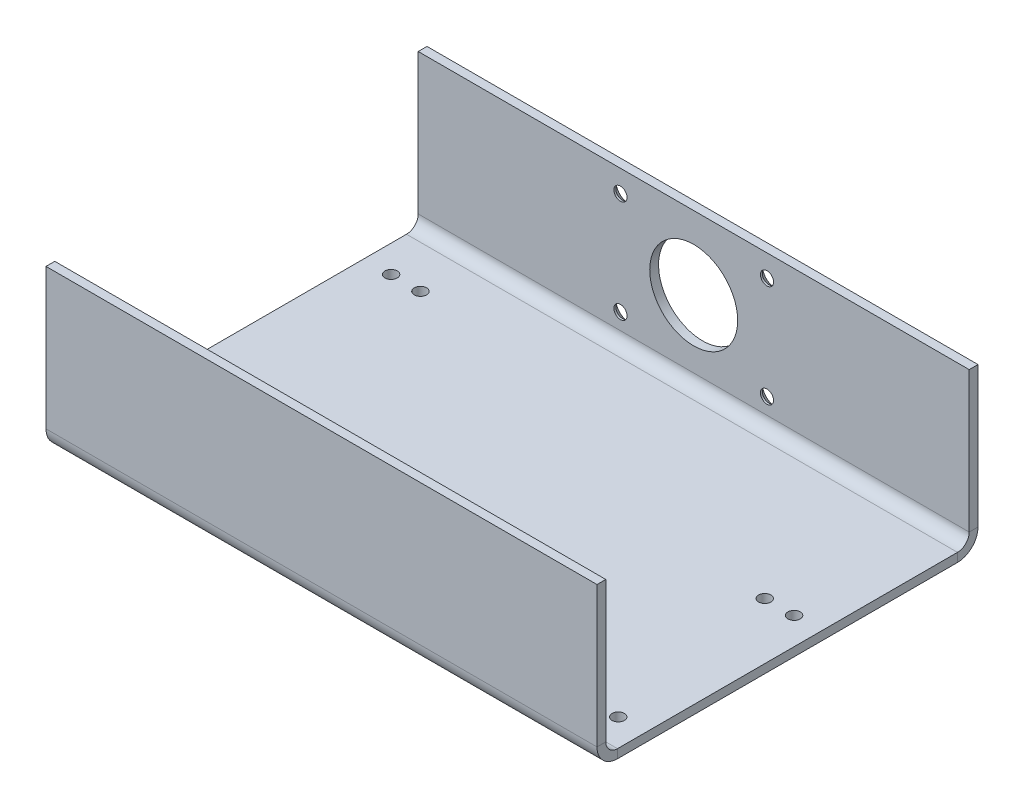
ISO-10303-21;
HEADER;
FILE_DESCRIPTION(('STEP AP214'),'2;1');
FILE_NAME('part.step','',(''),(''),'','','');
FILE_SCHEMA(('AUTOMOTIVE_DESIGN { 1 0 10303 214 1 1 1 1 }'));
ENDSEC;
DATA;
#1=APPLICATION_CONTEXT('core data for automotive mechanical design processes');
#2=APPLICATION_PROTOCOL_DEFINITION('international standard','automotive_design',2000,#1);
#3=PRODUCT_CONTEXT('',#1,'mechanical');
#4=PRODUCT('Part','Part','',(#3));
#5=PRODUCT_RELATED_PRODUCT_CATEGORY('part','',(#4));
#6=PRODUCT_DEFINITION_FORMATION('','',#4);
#7=PRODUCT_DEFINITION_CONTEXT('part definition',#1,'design');
#8=PRODUCT_DEFINITION('design','',#6,#7);
#9=PRODUCT_DEFINITION_SHAPE('','',#8);
#10=(LENGTH_UNIT() NAMED_UNIT(*) SI_UNIT(.MILLI.,.METRE.));
#11=(NAMED_UNIT(*) PLANE_ANGLE_UNIT() SI_UNIT($,.RADIAN.));
#12=(NAMED_UNIT(*) SI_UNIT($,.STERADIAN.) SOLID_ANGLE_UNIT());
#13=UNCERTAINTY_MEASURE_WITH_UNIT(LENGTH_MEASURE(1.E-05),#10,'distance_accuracy_value','');
#14=(GEOMETRIC_REPRESENTATION_CONTEXT(3) GLOBAL_UNCERTAINTY_ASSIGNED_CONTEXT((#13)) GLOBAL_UNIT_ASSIGNED_CONTEXT((#10,
#11,#12)) REPRESENTATION_CONTEXT('',''));
#15=CARTESIAN_POINT('',(0.,0.,0.));
#16=DIRECTION('',(0.,0.,1.));
#17=DIRECTION('',(1.,0.,0.));
#18=AXIS2_PLACEMENT_3D('',#15,#16,#17);
#19=CARTESIAN_POINT('',(0.,-2.35988495893514E-13,-65.));
#20=DIRECTION('',(0.,0.,1.));
#21=DIRECTION('',(0.,-1.,0.));
#22=AXIS2_PLACEMENT_3D('',#19,#20,#21);
#23=PLANE('',#22);
#24=CARTESIAN_POINT('',(24.9999999999492,12.5210335892413,-65.));
#25=DIRECTION('',(0.,0.,-1.));
#26=DIRECTION('',(0.,1.,0.));
#27=AXIS2_PLACEMENT_3D('',#24,#25,#26);
#28=CIRCLE('',#27,4.59);
#29=CARTESIAN_POINT('',(24.9999999999492,17.1110335892413,-65.));
#30=VERTEX_POINT('',#29);
#31=EDGE_CURVE('E311',#30,#30,#28,.T.);
#32=ORIENTED_EDGE('',*,*,#31,.F.);
#33=EDGE_LOOP('',(#32));
#34=FACE_BOUND('',#33,.T.);
#35=CARTESIAN_POINT('',(-25.0000000000508,47.4789664107578,-65.0000000000001));
#36=DIRECTION('',(0.,0.,-1.));
#37=DIRECTION('',(0.,1.,0.));
#38=AXIS2_PLACEMENT_3D('',#35,#36,#37);
#39=CIRCLE('',#38,4.59);
#40=CARTESIAN_POINT('',(-25.0000000000508,52.0689664107578,-65.0000000000002));
#41=VERTEX_POINT('',#40);
#42=EDGE_CURVE('E304',#41,#41,#39,.T.);
#43=ORIENTED_EDGE('',*,*,#42,.F.);
#44=EDGE_LOOP('',(#43));
#45=FACE_BOUND('',#44,.T.);
#46=CARTESIAN_POINT('',(-25.0000000000508,12.5210335892413,-65.));
#47=DIRECTION('',(0.,0.,-1.));
#48=DIRECTION('',(0.,1.,0.));
#49=AXIS2_PLACEMENT_3D('',#46,#47,#48);
#50=CIRCLE('',#49,4.59);
#51=CARTESIAN_POINT('',(-25.0000000000508,17.1110335892413,-65.));
#52=VERTEX_POINT('',#51);
#53=EDGE_CURVE('E300',#52,#52,#50,.T.);
#54=ORIENTED_EDGE('',*,*,#53,.F.);
#55=EDGE_LOOP('',(#54));
#56=FACE_BOUND('',#55,.T.);
#57=CARTESIAN_POINT('',(-5.09869924059103E-11,29.9999999999996,-65.0000000000001));
#58=DIRECTION('',(0.,0.,-1.));
#59=DIRECTION('',(0.,1.,0.));
#60=AXIS2_PLACEMENT_3D('',#57,#58,#59);
#61=CIRCLE('',#60,15.);
#62=CARTESIAN_POINT('',(-5.09869924059103E-11,44.9999999999996,-65.0000000000001));
#63=VERTEX_POINT('',#62);
#64=EDGE_CURVE('E293',#63,#63,#61,.T.);
#65=ORIENTED_EDGE('',*,*,#64,.F.);
#66=EDGE_LOOP('',(#65));
#67=FACE_BOUND('',#66,.T.);
#68=DIRECTION('',(-1.,0.,0.));
#69=VECTOR('',#68,1.);
#70=CARTESIAN_POINT('',(94.,7.00000000000001,-65.));
#71=LINE('',#70,#69);
#72=CARTESIAN_POINT('',(-94.,7.00000000000001,-65.));
#73=VERTEX_POINT('',#72);
#74=CARTESIAN_POINT('',(94.,6.99999999999994,-65.));
#75=VERTEX_POINT('',#74);
#76=EDGE_CURVE('E255',#73,#75,#71,.F.);
#77=ORIENTED_EDGE('',*,*,#76,.F.);
#78=DIRECTION('',(0.,1.,0.));
#79=VECTOR('',#78,1.);
#80=CARTESIAN_POINT('',(-94.,-1.8581495535757E-13,-65.));
#81=LINE('',#80,#79);
#82=CARTESIAN_POINT('',(-94.,55.,-65.0000000000002));
#83=VERTEX_POINT('',#82);
#84=EDGE_CURVE('E243',#73,#83,#81,.T.);
#85=ORIENTED_EDGE('',*,*,#84,.T.);
#86=DIRECTION('',(1.,0.,0.));
#87=VECTOR('',#86,1.);
#88=CARTESIAN_POINT('',(0.,55.,-65.0000000000002));
#89=LINE('',#88,#87);
#90=CARTESIAN_POINT('',(94.,55.,-65.0000000000002));
#91=VERTEX_POINT('',#90);
#92=EDGE_CURVE('E241',#83,#91,#89,.T.);
#93=ORIENTED_EDGE('',*,*,#92,.T.);
#94=DIRECTION('',(0.,-1.,0.));
#95=VECTOR('',#94,1.);
#96=CARTESIAN_POINT('',(94.,-2.86162036429459E-13,-65.));
#97=LINE('',#96,#95);
#98=EDGE_CURVE('E245',#91,#75,#97,.T.);
#99=ORIENTED_EDGE('',*,*,#98,.T.);
#100=EDGE_LOOP('',(#77,#85,#93,#99));
#101=FACE_BOUND('',#100,.T.);
#102=CARTESIAN_POINT('',(24.9999999999492,47.4789664107578,-65.0000000000001));
#103=DIRECTION('',(0.,0.,-1.));
#104=DIRECTION('',(0.,1.,0.));
#105=AXIS2_PLACEMENT_3D('',#102,#103,#104);
#106=CIRCLE('',#105,4.59);
#107=CARTESIAN_POINT('',(24.9999999999492,52.0689664107578,-65.0000000000002));
#108=VERTEX_POINT('',#107);
#109=EDGE_CURVE('E796',#108,#108,#106,.T.);
#110=ORIENTED_EDGE('',*,*,#109,.F.);
#111=EDGE_LOOP('',(#110));
#112=FACE_BOUND('',#111,.T.);
#113=ADVANCED_FACE('F80',(#34,#45,#56,#67,#101,#112),#23,.F.);
#114=CARTESIAN_POINT('',(0.,3.,0.));
#115=DIRECTION('',(0.,-1.,0.));
#116=DIRECTION('',(0.,0.,-1.));
#117=AXIS2_PLACEMENT_3D('',#114,#115,#116);
#118=PLANE('',#117);
#119=CARTESIAN_POINT('',(74.7500000000055,3.,-11.4999999999954));
#120=DIRECTION('',(0.,-1.,0.));
#121=DIRECTION('',(0.,0.,-1.));
#122=AXIS2_PLACEMENT_3D('',#119,#120,#121);
#123=CIRCLE('',#122,2.1);
#124=CARTESIAN_POINT('',(74.7500000000055,3.,-13.5999999999954));
#125=VERTEX_POINT('',#124);
#126=EDGE_CURVE('E795',#125,#125,#123,.T.);
#127=ORIENTED_EDGE('',*,*,#126,.T.);
#128=EDGE_LOOP('',(#127));
#129=FACE_BOUND('',#128,.T.);
#130=CARTESIAN_POINT('',(-84.7500000000008,3.,16.5000000000021));
#131=DIRECTION('',(0.,-1.,0.));
#132=DIRECTION('',(0.,0.,-1.));
#133=AXIS2_PLACEMENT_3D('',#130,#131,#132);
#134=CIRCLE('',#133,2.1);
#135=CARTESIAN_POINT('',(-84.7500000000008,3.,14.4000000000021));
#136=VERTEX_POINT('',#135);
#137=EDGE_CURVE('E797',#136,#136,#134,.T.);
#138=ORIENTED_EDGE('',*,*,#137,.T.);
#139=EDGE_LOOP('',(#138));
#140=FACE_BOUND('',#139,.T.);
#141=CARTESIAN_POINT('',(-74.7500000000008,3.,16.500000000002));
#142=DIRECTION('',(0.,-1.,0.));
#143=DIRECTION('',(0.,0.,-1.));
#144=AXIS2_PLACEMENT_3D('',#141,#142,#143);
#145=CIRCLE('',#144,2.1);
#146=CARTESIAN_POINT('',(-74.7500000000008,3.,14.400000000002));
#147=VERTEX_POINT('',#146);
#148=EDGE_CURVE('E803',#147,#147,#145,.T.);
#149=ORIENTED_EDGE('',*,*,#148,.T.);
#150=EDGE_LOOP('',(#149));
#151=FACE_BOUND('',#150,.T.);
#152=CARTESIAN_POINT('',(-84.750000000001,3.,-43.4999999999979));
#153=DIRECTION('',(0.,-1.,0.));
#154=DIRECTION('',(0.,0.,-1.));
#155=AXIS2_PLACEMENT_3D('',#152,#153,#154);
#156=CIRCLE('',#155,2.1);
#157=CARTESIAN_POINT('',(-84.750000000001,3.,-45.5999999999979));
#158=VERTEX_POINT('',#157);
#159=EDGE_CURVE('E850',#158,#158,#156,.T.);
#160=ORIENTED_EDGE('',*,*,#159,.T.);
#161=EDGE_LOOP('',(#160));
#162=FACE_BOUND('',#161,.T.);
#163=CARTESIAN_POINT('',(84.7500000000057,3.,48.5000000000046));
#164=DIRECTION('',(0.,-1.,0.));
#165=DIRECTION('',(0.,0.,-1.));
#166=AXIS2_PLACEMENT_3D('',#163,#164,#165);
#167=CIRCLE('',#166,2.1);
#168=CARTESIAN_POINT('',(84.7500000000057,3.,46.4000000000045));
#169=VERTEX_POINT('',#168);
#170=EDGE_CURVE('E853',#169,#169,#167,.T.);
#171=ORIENTED_EDGE('',*,*,#170,.T.);
#172=EDGE_LOOP('',(#171));
#173=FACE_BOUND('',#172,.T.);
#174=CARTESIAN_POINT('',(74.7500000000057,3.,48.5000000000046));
#175=DIRECTION('',(0.,-1.,0.));
#176=DIRECTION('',(0.,0.,-1.));
#177=AXIS2_PLACEMENT_3D('',#174,#175,#176);
#178=CIRCLE('',#177,2.1);
#179=CARTESIAN_POINT('',(74.7500000000057,3.,46.4000000000046));
#180=VERTEX_POINT('',#179);
#181=EDGE_CURVE('E856',#180,#180,#178,.T.);
#182=ORIENTED_EDGE('',*,*,#181,.T.);
#183=EDGE_LOOP('',(#182));
#184=FACE_BOUND('',#183,.T.);
#185=CARTESIAN_POINT('',(84.7500000000055,3.,-11.4999999999954));
#186=DIRECTION('',(0.,-1.,0.));
#187=DIRECTION('',(0.,0.,-1.));
#188=AXIS2_PLACEMENT_3D('',#185,#186,#187);
#189=CIRCLE('',#188,2.1);
#190=CARTESIAN_POINT('',(84.7500000000055,3.,-13.5999999999954));
#191=VERTEX_POINT('',#190);
#192=EDGE_CURVE('E859',#191,#191,#189,.T.);
#193=ORIENTED_EDGE('',*,*,#192,.T.);
#194=EDGE_LOOP('',(#193));
#195=FACE_BOUND('',#194,.T.);
#196=CARTESIAN_POINT('',(-74.750000000001,3.,-43.499999999998));
#197=DIRECTION('',(0.,-1.,0.));
#198=DIRECTION('',(0.,0.,-1.));
#199=AXIS2_PLACEMENT_3D('',#196,#197,#198);
#200=CIRCLE('',#199,2.1);
#201=CARTESIAN_POINT('',(-74.750000000001,3.,-45.599999999998));
#202=VERTEX_POINT('',#201);
#203=EDGE_CURVE('E862',#202,#202,#200,.T.);
#204=ORIENTED_EDGE('',*,*,#203,.T.);
#205=EDGE_LOOP('',(#204));
#206=FACE_BOUND('',#205,.T.);
#207=DIRECTION('',(1.,0.,0.));
#208=VECTOR('',#207,1.);
#209=CARTESIAN_POINT('',(94.,2.99999999999999,58.));
#210=LINE('',#209,#208);
#211=CARTESIAN_POINT('',(94.,2.99999999999999,58.));
#212=VERTEX_POINT('',#211);
#213=CARTESIAN_POINT('',(-94.,2.99999999999999,58.));
#214=VERTEX_POINT('',#213);
#215=EDGE_CURVE('E224',#212,#214,#210,.F.);
#216=ORIENTED_EDGE('',*,*,#215,.F.);
#217=DIRECTION('',(0.,0.,-1.));
#218=VECTOR('',#217,1.);
#219=CARTESIAN_POINT('',(94.,3.,65.));
#220=LINE('',#219,#218);
#221=CARTESIAN_POINT('',(94.,2.99999999999996,-58.));
#222=VERTEX_POINT('',#221);
#223=EDGE_CURVE('E89',#212,#222,#220,.T.);
#224=ORIENTED_EDGE('',*,*,#223,.T.);
#225=DIRECTION('',(-1.,0.,0.));
#226=VECTOR('',#225,1.);
#227=CARTESIAN_POINT('',(-94.,2.99999999999996,-58.));
#228=LINE('',#227,#226);
#229=CARTESIAN_POINT('',(-94.,2.99999999999996,-58.));
#230=VERTEX_POINT('',#229);
#231=EDGE_CURVE('E275',#230,#222,#228,.F.);
#232=ORIENTED_EDGE('',*,*,#231,.F.);
#233=DIRECTION('',(0.,0.,1.));
#234=VECTOR('',#233,1.);
#235=CARTESIAN_POINT('',(-94.,3.,65.));
#236=LINE('',#235,#234);
#237=EDGE_CURVE('E13',#230,#214,#236,.T.);
#238=ORIENTED_EDGE('',*,*,#237,.T.);
#239=EDGE_LOOP('',(#216,#224,#232,#238));
#240=FACE_BOUND('',#239,.T.);
#241=ADVANCED_FACE('F351',(#129,#140,#151,#162,#173,#184,#195,#206,#240),#118,.F.);
#242=CARTESIAN_POINT('',(0.,0.,0.));
#243=DIRECTION('',(0.,-1.,0.));
#244=DIRECTION('',(0.,0.,-1.));
#245=AXIS2_PLACEMENT_3D('',#242,#243,#244);
#246=PLANE('',#245);
#247=CARTESIAN_POINT('',(74.7500000000055,0.,-11.4999999999954));
#248=DIRECTION('',(0.,-1.,0.));
#249=DIRECTION('',(0.,0.,-1.));
#250=AXIS2_PLACEMENT_3D('',#247,#248,#249);
#251=CIRCLE('',#250,2.1);
#252=CARTESIAN_POINT('',(74.7500000000055,0.,-13.5999999999954));
#253=VERTEX_POINT('',#252);
#254=EDGE_CURVE('E792',#253,#253,#251,.T.);
#255=ORIENTED_EDGE('',*,*,#254,.F.);
#256=EDGE_LOOP('',(#255));
#257=FACE_BOUND('',#256,.T.);
#258=CARTESIAN_POINT('',(-84.7500000000008,0.,16.5000000000021));
#259=DIRECTION('',(0.,-1.,0.));
#260=DIRECTION('',(0.,0.,-1.));
#261=AXIS2_PLACEMENT_3D('',#258,#259,#260);
#262=CIRCLE('',#261,2.1);
#263=CARTESIAN_POINT('',(-84.7500000000008,0.,14.4000000000021));
#264=VERTEX_POINT('',#263);
#265=EDGE_CURVE('E872',#264,#264,#262,.T.);
#266=ORIENTED_EDGE('',*,*,#265,.F.);
#267=EDGE_LOOP('',(#266));
#268=FACE_BOUND('',#267,.T.);
#269=CARTESIAN_POINT('',(-74.7500000000008,0.,16.500000000002));
#270=DIRECTION('',(0.,-1.,0.));
#271=DIRECTION('',(0.,0.,-1.));
#272=AXIS2_PLACEMENT_3D('',#269,#270,#271);
#273=CIRCLE('',#272,2.1);
#274=CARTESIAN_POINT('',(-74.7500000000008,0.,14.400000000002));
#275=VERTEX_POINT('',#274);
#276=EDGE_CURVE('E869',#275,#275,#273,.T.);
#277=ORIENTED_EDGE('',*,*,#276,.F.);
#278=EDGE_LOOP('',(#277));
#279=FACE_BOUND('',#278,.T.);
#280=CARTESIAN_POINT('',(-84.750000000001,0.,-43.4999999999979));
#281=DIRECTION('',(0.,-1.,0.));
#282=DIRECTION('',(0.,0.,-1.));
#283=AXIS2_PLACEMENT_3D('',#280,#281,#282);
#284=CIRCLE('',#283,2.1);
#285=CARTESIAN_POINT('',(-84.750000000001,0.,-45.5999999999979));
#286=VERTEX_POINT('',#285);
#287=EDGE_CURVE('E868',#286,#286,#284,.T.);
#288=ORIENTED_EDGE('',*,*,#287,.F.);
#289=EDGE_LOOP('',(#288));
#290=FACE_BOUND('',#289,.T.);
#291=CARTESIAN_POINT('',(84.7500000000057,0.,48.5000000000046));
#292=DIRECTION('',(0.,-1.,0.));
#293=DIRECTION('',(0.,0.,-1.));
#294=AXIS2_PLACEMENT_3D('',#291,#292,#293);
#295=CIRCLE('',#294,2.1);
#296=CARTESIAN_POINT('',(84.7500000000057,0.,46.4000000000045));
#297=VERTEX_POINT('',#296);
#298=EDGE_CURVE('E882',#297,#297,#295,.T.);
#299=ORIENTED_EDGE('',*,*,#298,.F.);
#300=EDGE_LOOP('',(#299));
#301=FACE_BOUND('',#300,.T.);
#302=CARTESIAN_POINT('',(74.7500000000057,0.,48.5000000000046));
#303=DIRECTION('',(0.,-1.,0.));
#304=DIRECTION('',(0.,0.,-1.));
#305=AXIS2_PLACEMENT_3D('',#302,#303,#304);
#306=CIRCLE('',#305,2.1);
#307=CARTESIAN_POINT('',(74.7500000000057,0.,46.4000000000046));
#308=VERTEX_POINT('',#307);
#309=EDGE_CURVE('E879',#308,#308,#306,.T.);
#310=ORIENTED_EDGE('',*,*,#309,.F.);
#311=EDGE_LOOP('',(#310));
#312=FACE_BOUND('',#311,.T.);
#313=CARTESIAN_POINT('',(84.7500000000055,0.,-11.4999999999954));
#314=DIRECTION('',(0.,-1.,0.));
#315=DIRECTION('',(0.,0.,-1.));
#316=AXIS2_PLACEMENT_3D('',#313,#314,#315);
#317=CIRCLE('',#316,2.1);
#318=CARTESIAN_POINT('',(84.7500000000055,0.,-13.5999999999954));
#319=VERTEX_POINT('',#318);
#320=EDGE_CURVE('E876',#319,#319,#317,.T.);
#321=ORIENTED_EDGE('',*,*,#320,.F.);
#322=EDGE_LOOP('',(#321));
#323=FACE_BOUND('',#322,.T.);
#324=CARTESIAN_POINT('',(-74.750000000001,0.,-43.499999999998));
#325=DIRECTION('',(0.,-1.,0.));
#326=DIRECTION('',(0.,0.,-1.));
#327=AXIS2_PLACEMENT_3D('',#324,#325,#326);
#328=CIRCLE('',#327,2.1);
#329=CARTESIAN_POINT('',(-74.750000000001,0.,-45.599999999998));
#330=VERTEX_POINT('',#329);
#331=EDGE_CURVE('E865',#330,#330,#328,.T.);
#332=ORIENTED_EDGE('',*,*,#331,.F.);
#333=EDGE_LOOP('',(#332));
#334=FACE_BOUND('',#333,.T.);
#335=DIRECTION('',(0.,0.,-1.));
#336=VECTOR('',#335,1.);
#337=CARTESIAN_POINT('',(94.,0.,0.));
#338=LINE('',#337,#336);
#339=CARTESIAN_POINT('',(94.,0.,58.));
#340=VERTEX_POINT('',#339);
#341=CARTESIAN_POINT('',(94.,0.,-58.));
#342=VERTEX_POINT('',#341);
#343=EDGE_CURVE('E281',#340,#342,#338,.T.);
#344=ORIENTED_EDGE('',*,*,#343,.F.);
#345=DIRECTION('',(1.,0.,0.));
#346=VECTOR('',#345,1.);
#347=CARTESIAN_POINT('',(94.,0.,58.));
#348=LINE('',#347,#346);
#349=CARTESIAN_POINT('',(-94.,0.,58.));
#350=VERTEX_POINT('',#349);
#351=EDGE_CURVE('E213',#340,#350,#348,.F.);
#352=ORIENTED_EDGE('',*,*,#351,.T.);
#353=DIRECTION('',(0.,0.,-1.));
#354=VECTOR('',#353,1.);
#355=CARTESIAN_POINT('',(-94.,0.,0.));
#356=LINE('',#355,#354);
#357=CARTESIAN_POINT('',(-94.,0.,-58.));
#358=VERTEX_POINT('',#357);
#359=EDGE_CURVE('E285',#358,#350,#356,.F.);
#360=ORIENTED_EDGE('',*,*,#359,.F.);
#361=DIRECTION('',(-1.,0.,0.));
#362=VECTOR('',#361,1.);
#363=CARTESIAN_POINT('',(-94.,0.,-58.));
#364=LINE('',#363,#362);
#365=EDGE_CURVE('E264',#358,#342,#364,.F.);
#366=ORIENTED_EDGE('',*,*,#365,.T.);
#367=EDGE_LOOP('',(#344,#352,#360,#366));
#368=FACE_BOUND('',#367,.T.);
#369=ADVANCED_FACE('F359',(#257,#268,#279,#290,#301,#312,#323,#334,#368),#246,.T.);
#370=CARTESIAN_POINT('',(94.,3.,65.));
#371=DIRECTION('',(-1.,0.,0.));
#372=DIRECTION('',(0.,0.,-1.));
#373=AXIS2_PLACEMENT_3D('',#370,#371,#372);
#374=PLANE('',#373);
#375=ORIENTED_EDGE('',*,*,#223,.F.);
#376=DIRECTION('',(0.,-1.,0.));
#377=VECTOR('',#376,1.);
#378=CARTESIAN_POINT('',(94.,2.99999999999999,58.));
#379=LINE('',#378,#377);
#380=EDGE_CURVE('E218',#212,#340,#379,.T.);
#381=ORIENTED_EDGE('',*,*,#380,.T.);
#382=ORIENTED_EDGE('',*,*,#343,.T.);
#383=DIRECTION('',(0.,-1.,0.));
#384=VECTOR('',#383,1.);
#385=CARTESIAN_POINT('',(94.,2.99999999999996,-58.));
#386=LINE('',#385,#384);
#387=EDGE_CURVE('E279',#222,#342,#386,.T.);
#388=ORIENTED_EDGE('',*,*,#387,.F.);
#389=EDGE_LOOP('',(#375,#381,#382,#388));
#390=FACE_BOUND('',#389,.T.);
#391=ADVANCED_FACE('F399',(#390),#374,.F.);
#392=CARTESIAN_POINT('',(-94.,3.,65.));
#393=DIRECTION('',(1.,0.,0.));
#394=DIRECTION('',(0.,0.,1.));
#395=AXIS2_PLACEMENT_3D('',#392,#393,#394);
#396=PLANE('',#395);
#397=DIRECTION('',(0.,-1.,0.));
#398=VECTOR('',#397,1.);
#399=CARTESIAN_POINT('',(-94.,2.99999999999999,58.));
#400=LINE('',#399,#398);
#401=EDGE_CURVE('E229',#214,#350,#400,.T.);
#402=ORIENTED_EDGE('',*,*,#401,.F.);
#403=ORIENTED_EDGE('',*,*,#237,.F.);
#404=DIRECTION('',(0.,-1.,0.));
#405=VECTOR('',#404,1.);
#406=CARTESIAN_POINT('',(-94.,2.99999999999996,-58.));
#407=LINE('',#406,#405);
#408=EDGE_CURVE('E269',#230,#358,#407,.T.);
#409=ORIENTED_EDGE('',*,*,#408,.T.);
#410=ORIENTED_EDGE('',*,*,#359,.T.);
#411=EDGE_LOOP('',(#402,#403,#409,#410));
#412=FACE_BOUND('',#411,.T.);
#413=ADVANCED_FACE('F82',(#412),#396,.F.);
#414=CARTESIAN_POINT('',(94.,6.99999999999996,-58.));
#415=DIRECTION('',(1.,0.,0.));
#416=DIRECTION('',(0.,0.,-1.));
#417=AXIS2_PLACEMENT_3D('',#414,#415,#416);
#418=PLANE('',#417);
#419=DIRECTION('',(0.,0.,1.));
#420=VECTOR('',#419,1.);
#421=CARTESIAN_POINT('',(94.,7.00000000000001,-65.));
#422=LINE('',#421,#420);
#423=CARTESIAN_POINT('',(94.,6.99999999999995,-62.));
#424=VERTEX_POINT('',#423);
#425=EDGE_CURVE('E231',#424,#75,#422,.F.);
#426=ORIENTED_EDGE('',*,*,#425,.F.);
#427=CARTESIAN_POINT('',(94.,6.99999999999996,-58.));
#428=DIRECTION('',(-1.,0.,0.));
#429=DIRECTION('',(0.,0.,1.));
#430=AXIS2_PLACEMENT_3D('',#427,#428,#429);
#431=CIRCLE('',#430,4.);
#432=EDGE_CURVE('E272',#222,#424,#431,.F.);
#433=ORIENTED_EDGE('',*,*,#432,.F.);
#434=ORIENTED_EDGE('',*,*,#387,.T.);
#435=CARTESIAN_POINT('',(94.,6.99999999999996,-58.));
#436=DIRECTION('',(-1.,0.,0.));
#437=DIRECTION('',(0.,0.,1.));
#438=AXIS2_PLACEMENT_3D('',#435,#436,#437);
#439=CIRCLE('',#438,7.);
#440=EDGE_CURVE('E97',#342,#75,#439,.F.);
#441=ORIENTED_EDGE('',*,*,#440,.T.);
#442=EDGE_LOOP('',(#426,#433,#434,#441));
#443=FACE_BOUND('',#442,.T.);
#444=ADVANCED_FACE('F391',(#443),#418,.T.);
#445=CARTESIAN_POINT('',(-94.,6.99999999999996,-58.));
#446=DIRECTION('',(1.,0.,0.));
#447=DIRECTION('',(0.,0.,-1.));
#448=AXIS2_PLACEMENT_3D('',#445,#446,#447);
#449=PLANE('',#448);
#450=CARTESIAN_POINT('',(-94.,6.99999999999996,-58.));
#451=DIRECTION('',(-1.,0.,0.));
#452=DIRECTION('',(0.,0.,1.));
#453=AXIS2_PLACEMENT_3D('',#450,#451,#452);
#454=CIRCLE('',#453,4.);
#455=CARTESIAN_POINT('',(-94.,6.99999999999995,-62.));
#456=VERTEX_POINT('',#455);
#457=EDGE_CURVE('E237',#456,#230,#454,.T.);
#458=ORIENTED_EDGE('',*,*,#457,.F.);
#459=DIRECTION('',(0.,0.,1.));
#460=VECTOR('',#459,1.);
#461=CARTESIAN_POINT('',(-94.,6.99999999999999,-62.));
#462=LINE('',#461,#460);
#463=EDGE_CURVE('E257',#456,#73,#462,.F.);
#464=ORIENTED_EDGE('',*,*,#463,.T.);
#465=CARTESIAN_POINT('',(-94.,6.99999999999996,-58.));
#466=DIRECTION('',(-1.,0.,0.));
#467=DIRECTION('',(0.,0.,1.));
#468=AXIS2_PLACEMENT_3D('',#465,#466,#467);
#469=CIRCLE('',#468,7.);
#470=EDGE_CURVE('E267',#73,#358,#469,.T.);
#471=ORIENTED_EDGE('',*,*,#470,.T.);
#472=ORIENTED_EDGE('',*,*,#408,.F.);
#473=EDGE_LOOP('',(#458,#464,#471,#472));
#474=FACE_BOUND('',#473,.T.);
#475=ADVANCED_FACE('F387',(#474),#449,.F.);
#476=CARTESIAN_POINT('',(-94.,6.99999999999996,-58.));
#477=DIRECTION('',(-1.,0.,0.));
#478=DIRECTION('',(0.,0.,-1.));
#479=AXIS2_PLACEMENT_3D('',#476,#477,#478);
#480=CYLINDRICAL_SURFACE('',#479,7.);
#481=ORIENTED_EDGE('',*,*,#365,.F.);
#482=ORIENTED_EDGE('',*,*,#470,.F.);
#483=ORIENTED_EDGE('',*,*,#76,.T.);
#484=ORIENTED_EDGE('',*,*,#440,.F.);
#485=EDGE_LOOP('',(#481,#482,#483,#484));
#486=FACE_BOUND('',#485,.T.);
#487=ADVANCED_FACE('F384',(#486),#480,.T.);
#488=CARTESIAN_POINT('',(-94.,6.99999999999996,-58.));
#489=DIRECTION('',(-1.,0.,0.));
#490=DIRECTION('',(0.,0.,-1.));
#491=AXIS2_PLACEMENT_3D('',#488,#489,#490);
#492=CYLINDRICAL_SURFACE('',#491,4.);
#493=ORIENTED_EDGE('',*,*,#231,.T.);
#494=ORIENTED_EDGE('',*,*,#432,.T.);
#495=DIRECTION('',(-1.,0.,0.));
#496=VECTOR('',#495,1.);
#497=CARTESIAN_POINT('',(94.,6.99999999999999,-62.));
#498=LINE('',#497,#496);
#499=EDGE_CURVE('E260',#424,#456,#498,.T.);
#500=ORIENTED_EDGE('',*,*,#499,.T.);
#501=ORIENTED_EDGE('',*,*,#457,.T.);
#502=EDGE_LOOP('',(#493,#494,#500,#501));
#503=FACE_BOUND('',#502,.T.);
#504=ADVANCED_FACE('F382',(#503),#492,.F.);
#505=CARTESIAN_POINT('',(94.,2.99999999999999,-65.));
#506=DIRECTION('',(-1.,0.,0.));
#507=DIRECTION('',(0.,-1.,0.));
#508=AXIS2_PLACEMENT_3D('',#505,#506,#507);
#509=PLANE('',#508);
#510=ORIENTED_EDGE('',*,*,#425,.T.);
#511=ORIENTED_EDGE('',*,*,#98,.F.);
#512=DIRECTION('',(0.,0.,1.));
#513=VECTOR('',#512,1.);
#514=CARTESIAN_POINT('',(94.,55.,-65.0000000000002));
#515=LINE('',#514,#513);
#516=CARTESIAN_POINT('',(94.,55.,-62.0000000000002));
#517=VERTEX_POINT('',#516);
#518=EDGE_CURVE('E238',#91,#517,#515,.T.);
#519=ORIENTED_EDGE('',*,*,#518,.T.);
#520=DIRECTION('',(0.,1.,0.));
#521=VECTOR('',#520,1.);
#522=CARTESIAN_POINT('',(94.,3.,-62.));
#523=LINE('',#522,#521);
#524=EDGE_CURVE('E252',#517,#424,#523,.F.);
#525=ORIENTED_EDGE('',*,*,#524,.T.);
#526=EDGE_LOOP('',(#510,#511,#519,#525));
#527=FACE_BOUND('',#526,.T.);
#528=ADVANCED_FACE('F378',(#527),#509,.F.);
#529=CARTESIAN_POINT('',(-94.,55.,-65.0000000000002));
#530=DIRECTION('',(1.,0.,0.));
#531=DIRECTION('',(0.,1.,0.));
#532=AXIS2_PLACEMENT_3D('',#529,#530,#531);
#533=PLANE('',#532);
#534=ORIENTED_EDGE('',*,*,#463,.F.);
#535=DIRECTION('',(0.,-1.,0.));
#536=VECTOR('',#535,1.);
#537=CARTESIAN_POINT('',(-94.,55.,-62.0000000000002));
#538=LINE('',#537,#536);
#539=CARTESIAN_POINT('',(-94.,55.,-62.0000000000002));
#540=VERTEX_POINT('',#539);
#541=EDGE_CURVE('E250',#456,#540,#538,.F.);
#542=ORIENTED_EDGE('',*,*,#541,.T.);
#543=DIRECTION('',(0.,0.,1.));
#544=VECTOR('',#543,1.);
#545=CARTESIAN_POINT('',(-94.,55.,-65.0000000000002));
#546=LINE('',#545,#544);
#547=EDGE_CURVE('E234',#83,#540,#546,.T.);
#548=ORIENTED_EDGE('',*,*,#547,.F.);
#549=ORIENTED_EDGE('',*,*,#84,.F.);
#550=EDGE_LOOP('',(#534,#542,#548,#549));
#551=FACE_BOUND('',#550,.T.);
#552=ADVANCED_FACE('F370',(#551),#533,.F.);
#553=CARTESIAN_POINT('',(0.,-2.25514051876985E-13,-62.));
#554=DIRECTION('',(0.,0.,1.));
#555=DIRECTION('',(0.,-1.,0.));
#556=AXIS2_PLACEMENT_3D('',#553,#554,#555);
#557=PLANE('',#556);
#558=CARTESIAN_POINT('',(24.9999999999492,47.4789664107578,-62.0000000000001));
#559=DIRECTION('',(0.,0.,1.));
#560=DIRECTION('',(0.,-1.,0.));
#561=AXIS2_PLACEMENT_3D('',#558,#559,#560);
#562=CIRCLE('',#561,2.24999999999999);
#563=CARTESIAN_POINT('',(24.9999999999492,45.2289664107578,-62.0000000000001));
#564=VERTEX_POINT('',#563);
#565=EDGE_CURVE('E84',#564,#564,#562,.T.);
#566=ORIENTED_EDGE('',*,*,#565,.F.);
#567=EDGE_LOOP('',(#566));
#568=FACE_BOUND('',#567,.T.);
#569=CARTESIAN_POINT('',(24.9999999999492,12.5210335892414,-62.));
#570=DIRECTION('',(0.,0.,1.));
#571=DIRECTION('',(0.,-1.,0.));
#572=AXIS2_PLACEMENT_3D('',#569,#570,#571);
#573=CIRCLE('',#572,2.24999999999999);
#574=CARTESIAN_POINT('',(24.9999999999492,10.2710335892414,-62.));
#575=VERTEX_POINT('',#574);
#576=EDGE_CURVE('E302',#575,#575,#573,.T.);
#577=ORIENTED_EDGE('',*,*,#576,.F.);
#578=EDGE_LOOP('',(#577));
#579=FACE_BOUND('',#578,.T.);
#580=CARTESIAN_POINT('',(-25.0000000000508,47.4789664107578,-62.0000000000001));
#581=DIRECTION('',(0.,0.,1.));
#582=DIRECTION('',(0.,-1.,0.));
#583=AXIS2_PLACEMENT_3D('',#580,#581,#582);
#584=CIRCLE('',#583,2.24999999999999);
#585=CARTESIAN_POINT('',(-25.0000000000508,45.2289664107578,-62.0000000000001));
#586=VERTEX_POINT('',#585);
#587=EDGE_CURVE('E298',#586,#586,#584,.T.);
#588=ORIENTED_EDGE('',*,*,#587,.F.);
#589=EDGE_LOOP('',(#588));
#590=FACE_BOUND('',#589,.T.);
#591=CARTESIAN_POINT('',(-25.0000000000508,12.5210335892414,-62.));
#592=DIRECTION('',(0.,0.,1.));
#593=DIRECTION('',(0.,-1.,0.));
#594=AXIS2_PLACEMENT_3D('',#591,#592,#593);
#595=CIRCLE('',#594,2.24999999999999);
#596=CARTESIAN_POINT('',(-25.0000000000508,10.2710335892414,-62.));
#597=VERTEX_POINT('',#596);
#598=EDGE_CURVE('E294',#597,#597,#595,.T.);
#599=ORIENTED_EDGE('',*,*,#598,.F.);
#600=EDGE_LOOP('',(#599));
#601=FACE_BOUND('',#600,.T.);
#602=CARTESIAN_POINT('',(-5.09869924059103E-11,29.9999999999996,-62.0000000000001));
#603=DIRECTION('',(0.,0.,1.));
#604=DIRECTION('',(0.,-1.,0.));
#605=AXIS2_PLACEMENT_3D('',#602,#603,#604);
#606=CIRCLE('',#605,15.);
#607=CARTESIAN_POINT('',(-5.09869924059103E-11,14.9999999999996,-62.));
#608=VERTEX_POINT('',#607);
#609=EDGE_CURVE('E212',#608,#608,#606,.T.);
#610=ORIENTED_EDGE('',*,*,#609,.F.);
#611=EDGE_LOOP('',(#610));
#612=FACE_BOUND('',#611,.T.);
#613=ORIENTED_EDGE('',*,*,#541,.F.);
#614=ORIENTED_EDGE('',*,*,#499,.F.);
#615=ORIENTED_EDGE('',*,*,#524,.F.);
#616=DIRECTION('',(-1.,0.,0.));
#617=VECTOR('',#616,1.);
#618=CARTESIAN_POINT('',(94.,55.,-62.0000000000002));
#619=LINE('',#618,#617);
#620=EDGE_CURVE('E248',#540,#517,#619,.F.);
#621=ORIENTED_EDGE('',*,*,#620,.F.);
#622=EDGE_LOOP('',(#613,#614,#615,#621));
#623=FACE_BOUND('',#622,.T.);
#624=ADVANCED_FACE('F367',(#568,#579,#590,#601,#612,#623),#557,.T.);
#625=CARTESIAN_POINT('',(94.,55.,-65.0000000000002));
#626=DIRECTION('',(0.,-1.,0.));
#627=DIRECTION('',(0.,0.,-1.));
#628=AXIS2_PLACEMENT_3D('',#625,#626,#627);
#629=PLANE('',#628);
#630=ORIENTED_EDGE('',*,*,#620,.T.);
#631=ORIENTED_EDGE('',*,*,#518,.F.);
#632=ORIENTED_EDGE('',*,*,#92,.F.);
#633=ORIENTED_EDGE('',*,*,#547,.T.);
#634=EDGE_LOOP('',(#630,#631,#632,#633));
#635=FACE_BOUND('',#634,.T.);
#636=ADVANCED_FACE('F369',(#635),#629,.F.);
#637=CARTESIAN_POINT('',(-94.,6.99999999999999,58.));
#638=DIRECTION('',(-1.,0.,0.));
#639=DIRECTION('',(0.,0.,1.));
#640=AXIS2_PLACEMENT_3D('',#637,#638,#639);
#641=PLANE('',#640);
#642=DIRECTION('',(0.,0.,-1.));
#643=VECTOR('',#642,1.);
#644=CARTESIAN_POINT('',(-94.,6.99999999999999,65.));
#645=LINE('',#644,#643);
#646=CARTESIAN_POINT('',(-94.,6.99999999999999,62.));
#647=VERTEX_POINT('',#646);
#648=CARTESIAN_POINT('',(-94.,6.99999999999999,65.));
#649=VERTEX_POINT('',#648);
#650=EDGE_CURVE('E195',#647,#649,#645,.F.);
#651=ORIENTED_EDGE('',*,*,#650,.F.);
#652=CARTESIAN_POINT('',(-94.,6.99999999999999,58.));
#653=DIRECTION('',(1.,0.,0.));
#654=DIRECTION('',(0.,0.,-1.));
#655=AXIS2_PLACEMENT_3D('',#652,#653,#654);
#656=CIRCLE('',#655,4.);
#657=EDGE_CURVE('E221',#214,#647,#656,.F.);
#658=ORIENTED_EDGE('',*,*,#657,.F.);
#659=ORIENTED_EDGE('',*,*,#401,.T.);
#660=CARTESIAN_POINT('',(-94.,6.99999999999999,58.));
#661=DIRECTION('',(1.,0.,0.));
#662=DIRECTION('',(0.,0.,-1.));
#663=AXIS2_PLACEMENT_3D('',#660,#661,#662);
#664=CIRCLE('',#663,7.);
#665=EDGE_CURVE('E105',#350,#649,#664,.F.);
#666=ORIENTED_EDGE('',*,*,#665,.T.);
#667=EDGE_LOOP('',(#651,#658,#659,#666));
#668=FACE_BOUND('',#667,.T.);
#669=ADVANCED_FACE('F374',(#668),#641,.T.);
#670=CARTESIAN_POINT('',(94.,6.99999999999999,58.));
#671=DIRECTION('',(-1.,0.,0.));
#672=DIRECTION('',(0.,0.,1.));
#673=AXIS2_PLACEMENT_3D('',#670,#671,#672);
#674=PLANE('',#673);
#675=CARTESIAN_POINT('',(94.,6.99999999999999,58.));
#676=DIRECTION('',(1.,0.,0.));
#677=DIRECTION('',(0.,0.,-1.));
#678=AXIS2_PLACEMENT_3D('',#675,#676,#677);
#679=CIRCLE('',#678,4.);
#680=CARTESIAN_POINT('',(94.,6.99999999999999,62.));
#681=VERTEX_POINT('',#680);
#682=EDGE_CURVE('E226',#681,#212,#679,.T.);
#683=ORIENTED_EDGE('',*,*,#682,.F.);
#684=DIRECTION('',(0.,0.,-1.));
#685=VECTOR('',#684,1.);
#686=CARTESIAN_POINT('',(94.,6.99999999999999,62.));
#687=LINE('',#686,#685);
#688=CARTESIAN_POINT('',(94.,6.99999999999999,65.));
#689=VERTEX_POINT('',#688);
#690=EDGE_CURVE('E206',#681,#689,#687,.F.);
#691=ORIENTED_EDGE('',*,*,#690,.T.);
#692=CARTESIAN_POINT('',(94.,6.99999999999999,58.));
#693=DIRECTION('',(1.,0.,0.));
#694=DIRECTION('',(0.,0.,-1.));
#695=AXIS2_PLACEMENT_3D('',#692,#693,#694);
#696=CIRCLE('',#695,7.);
#697=EDGE_CURVE('E216',#689,#340,#696,.T.);
#698=ORIENTED_EDGE('',*,*,#697,.T.);
#699=ORIENTED_EDGE('',*,*,#380,.F.);
#700=EDGE_LOOP('',(#683,#691,#698,#699));
#701=FACE_BOUND('',#700,.T.);
#702=ADVANCED_FACE('F339',(#701),#674,.F.);
#703=CARTESIAN_POINT('',(94.,6.99999999999999,58.));
#704=DIRECTION('',(1.,0.,0.));
#705=DIRECTION('',(0.,0.,1.));
#706=AXIS2_PLACEMENT_3D('',#703,#704,#705);
#707=CYLINDRICAL_SURFACE('',#706,7.);
#708=ORIENTED_EDGE('',*,*,#351,.F.);
#709=ORIENTED_EDGE('',*,*,#697,.F.);
#710=DIRECTION('',(1.,0.,0.));
#711=VECTOR('',#710,1.);
#712=CARTESIAN_POINT('',(-94.,6.99999999999999,65.));
#713=LINE('',#712,#711);
#714=EDGE_CURVE('E204',#689,#649,#713,.F.);
#715=ORIENTED_EDGE('',*,*,#714,.T.);
#716=ORIENTED_EDGE('',*,*,#665,.F.);
#717=EDGE_LOOP('',(#708,#709,#715,#716));
#718=FACE_BOUND('',#717,.T.);
#719=ADVANCED_FACE('F418',(#718),#707,.T.);
#720=CARTESIAN_POINT('',(94.,6.99999999999999,58.));
#721=DIRECTION('',(1.,0.,0.));
#722=DIRECTION('',(0.,0.,1.));
#723=AXIS2_PLACEMENT_3D('',#720,#721,#722);
#724=CYLINDRICAL_SURFACE('',#723,4.);
#725=ORIENTED_EDGE('',*,*,#215,.T.);
#726=ORIENTED_EDGE('',*,*,#657,.T.);
#727=DIRECTION('',(1.,0.,0.));
#728=VECTOR('',#727,1.);
#729=CARTESIAN_POINT('',(-94.,6.99999999999999,62.));
#730=LINE('',#729,#728);
#731=EDGE_CURVE('E209',#647,#681,#730,.T.);
#732=ORIENTED_EDGE('',*,*,#731,.T.);
#733=ORIENTED_EDGE('',*,*,#682,.T.);
#734=EDGE_LOOP('',(#725,#726,#732,#733));
#735=FACE_BOUND('',#734,.T.);
#736=ADVANCED_FACE('F334',(#735),#724,.F.);
#737=CARTESIAN_POINT('',(-94.,3.,65.));
#738=DIRECTION('',(1.,0.,0.));
#739=DIRECTION('',(0.,1.,0.));
#740=AXIS2_PLACEMENT_3D('',#737,#738,#739);
#741=PLANE('',#740);
#742=ORIENTED_EDGE('',*,*,#650,.T.);
#743=DIRECTION('',(0.,-1.,0.));
#744=VECTOR('',#743,1.);
#745=CARTESIAN_POINT('',(-94.,0.,65.));
#746=LINE('',#745,#744);
#747=CARTESIAN_POINT('',(-94.,55.,65.));
#748=VERTEX_POINT('',#747);
#749=EDGE_CURVE('E176',#748,#649,#746,.T.);
#750=ORIENTED_EDGE('',*,*,#749,.F.);
#751=DIRECTION('',(0.,0.,-1.));
#752=VECTOR('',#751,1.);
#753=CARTESIAN_POINT('',(-94.,55.,65.));
#754=LINE('',#753,#752);
#755=CARTESIAN_POINT('',(-94.,55.,62.));
#756=VERTEX_POINT('',#755);
#757=EDGE_CURVE('E182',#748,#756,#754,.T.);
#758=ORIENTED_EDGE('',*,*,#757,.T.);
#759=DIRECTION('',(0.,1.,0.));
#760=VECTOR('',#759,1.);
#761=CARTESIAN_POINT('',(-94.,3.,62.));
#762=LINE('',#761,#760);
#763=EDGE_CURVE('E202',#756,#647,#762,.F.);
#764=ORIENTED_EDGE('',*,*,#763,.T.);
#765=EDGE_LOOP('',(#742,#750,#758,#764));
#766=FACE_BOUND('',#765,.T.);
#767=ADVANCED_FACE('F194',(#766),#741,.F.);
#768=CARTESIAN_POINT('',(94.,55.,65.));
#769=DIRECTION('',(-1.,0.,0.));
#770=DIRECTION('',(0.,-1.,0.));
#771=AXIS2_PLACEMENT_3D('',#768,#769,#770);
#772=PLANE('',#771);
#773=ORIENTED_EDGE('',*,*,#690,.F.);
#774=DIRECTION('',(0.,-1.,0.));
#775=VECTOR('',#774,1.);
#776=CARTESIAN_POINT('',(94.,55.,62.));
#777=LINE('',#776,#775);
#778=CARTESIAN_POINT('',(94.,55.,62.));
#779=VERTEX_POINT('',#778);
#780=EDGE_CURVE('E198',#681,#779,#777,.F.);
#781=ORIENTED_EDGE('',*,*,#780,.T.);
#782=DIRECTION('',(0.,0.,-1.));
#783=VECTOR('',#782,1.);
#784=CARTESIAN_POINT('',(94.,55.,65.));
#785=LINE('',#784,#783);
#786=CARTESIAN_POINT('',(94.,55.,65.));
#787=VERTEX_POINT('',#786);
#788=EDGE_CURVE('E191',#787,#779,#785,.T.);
#789=ORIENTED_EDGE('',*,*,#788,.F.);
#790=DIRECTION('',(0.,1.,0.));
#791=VECTOR('',#790,1.);
#792=CARTESIAN_POINT('',(94.,0.,65.));
#793=LINE('',#792,#791);
#794=EDGE_CURVE('E178',#689,#787,#793,.T.);
#795=ORIENTED_EDGE('',*,*,#794,.F.);
#796=EDGE_LOOP('',(#773,#781,#789,#795));
#797=FACE_BOUND('',#796,.T.);
#798=ADVANCED_FACE('F340',(#797),#772,.F.);
#799=CARTESIAN_POINT('',(0.,0.,65.));
#800=DIRECTION('',(0.,0.,-1.));
#801=DIRECTION('',(-1.,0.,0.));
#802=AXIS2_PLACEMENT_3D('',#799,#800,#801);
#803=PLANE('',#802);
#804=ORIENTED_EDGE('',*,*,#714,.F.);
#805=ORIENTED_EDGE('',*,*,#794,.T.);
#806=DIRECTION('',(-1.,0.,0.));
#807=VECTOR('',#806,1.);
#808=CARTESIAN_POINT('',(0.,55.,65.));
#809=LINE('',#808,#807);
#810=EDGE_CURVE('E171',#787,#748,#809,.T.);
#811=ORIENTED_EDGE('',*,*,#810,.T.);
#812=ORIENTED_EDGE('',*,*,#749,.T.);
#813=EDGE_LOOP('',(#804,#805,#811,#812));
#814=FACE_BOUND('',#813,.T.);
#815=ADVANCED_FACE('F174',(#814),#803,.F.);
#816=CARTESIAN_POINT('',(0.,0.,62.));
#817=DIRECTION('',(0.,0.,-1.));
#818=DIRECTION('',(-1.,0.,0.));
#819=AXIS2_PLACEMENT_3D('',#816,#817,#818);
#820=PLANE('',#819);
#821=ORIENTED_EDGE('',*,*,#780,.F.);
#822=ORIENTED_EDGE('',*,*,#731,.F.);
#823=ORIENTED_EDGE('',*,*,#763,.F.);
#824=DIRECTION('',(1.,0.,0.));
#825=VECTOR('',#824,1.);
#826=CARTESIAN_POINT('',(-94.,55.,62.));
#827=LINE('',#826,#825);
#828=EDGE_CURVE('E187',#779,#756,#827,.F.);
#829=ORIENTED_EDGE('',*,*,#828,.F.);
#830=EDGE_LOOP('',(#821,#822,#823,#829));
#831=FACE_BOUND('',#830,.T.);
#832=ADVANCED_FACE('F330',(#831),#820,.T.);
#833=CARTESIAN_POINT('',(-94.,55.,65.));
#834=DIRECTION('',(0.,-1.,0.));
#835=DIRECTION('',(0.,0.,-1.));
#836=AXIS2_PLACEMENT_3D('',#833,#834,#835);
#837=PLANE('',#836);
#838=ORIENTED_EDGE('',*,*,#828,.T.);
#839=ORIENTED_EDGE('',*,*,#757,.F.);
#840=ORIENTED_EDGE('',*,*,#810,.F.);
#841=ORIENTED_EDGE('',*,*,#788,.T.);
#842=EDGE_LOOP('',(#838,#839,#840,#841));
#843=FACE_BOUND('',#842,.T.);
#844=ADVANCED_FACE('F185',(#843),#837,.F.);
#845=CARTESIAN_POINT('',(-5.09869924059103E-11,29.9999999999996,-55.0000000000001));
#846=DIRECTION('',(0.,0.,-1.));
#847=DIRECTION('',(0.,1.,0.));
#848=AXIS2_PLACEMENT_3D('',#845,#846,#847);
#849=CYLINDRICAL_SURFACE('',#848,15.);
#850=ORIENTED_EDGE('',*,*,#609,.T.);
#851=EDGE_LOOP('',(#850));
#852=FACE_BOUND('',#851,.T.);
#853=ORIENTED_EDGE('',*,*,#64,.T.);
#854=EDGE_LOOP('',(#853));
#855=FACE_BOUND('',#854,.T.);
#856=ADVANCED_FACE('F485',(#852,#855),#849,.F.);
#857=CARTESIAN_POINT('',(-25.0000000000508,12.5210335892413,-65.));
#858=DIRECTION('',(0.,0.,-1.));
#859=DIRECTION('',(0.,1.,0.));
#860=AXIS2_PLACEMENT_3D('',#857,#858,#859);
#861=CYLINDRICAL_SURFACE('',#860,2.24999999999999);
#862=ORIENTED_EDGE('',*,*,#598,.T.);
#863=EDGE_LOOP('',(#862));
#864=FACE_BOUND('',#863,.T.);
#865=CARTESIAN_POINT('',(-25.0000000000508,12.5210335892414,-62.66));
#866=DIRECTION('',(0.,0.,-1.));
#867=DIRECTION('',(0.,1.,0.));
#868=AXIS2_PLACEMENT_3D('',#865,#866,#867);
#869=CIRCLE('',#868,2.24999999999999);
#870=CARTESIAN_POINT('',(-25.0000000000508,14.7710335892413,-62.66));
#871=VERTEX_POINT('',#870);
#872=EDGE_CURVE('E297',#871,#871,#869,.T.);
#873=ORIENTED_EDGE('',*,*,#872,.T.);
#874=EDGE_LOOP('',(#873));
#875=FACE_BOUND('',#874,.T.);
#876=ADVANCED_FACE('F493',(#864,#875),#861,.F.);
#877=CARTESIAN_POINT('',(-25.0000000000508,12.5210335892413,-65.));
#878=DIRECTION('',(0.,0.,-1.));
#879=DIRECTION('',(0.,1.,0.));
#880=AXIS2_PLACEMENT_3D('',#877,#878,#879);
#881=CONICAL_SURFACE('',#880,4.59,0.785398163397449);
#882=ORIENTED_EDGE('',*,*,#872,.F.);
#883=EDGE_LOOP('',(#882));
#884=FACE_BOUND('',#883,.T.);
#885=ORIENTED_EDGE('',*,*,#53,.T.);
#886=EDGE_LOOP('',(#885));
#887=FACE_BOUND('',#886,.T.);
#888=ADVANCED_FACE('F510',(#884,#887),#881,.F.);
#889=CARTESIAN_POINT('',(-25.0000000000508,47.4789664107578,-65.0000000000001));
#890=DIRECTION('',(0.,0.,-1.));
#891=DIRECTION('',(0.,1.,0.));
#892=AXIS2_PLACEMENT_3D('',#889,#890,#891);
#893=CYLINDRICAL_SURFACE('',#892,2.24999999999999);
#894=ORIENTED_EDGE('',*,*,#587,.T.);
#895=EDGE_LOOP('',(#894));
#896=FACE_BOUND('',#895,.T.);
#897=CARTESIAN_POINT('',(-25.0000000000508,47.4789664107578,-62.6600000000001));
#898=DIRECTION('',(0.,0.,-1.));
#899=DIRECTION('',(0.,1.,0.));
#900=AXIS2_PLACEMENT_3D('',#897,#898,#899);
#901=CIRCLE('',#900,2.24999999999999);
#902=CARTESIAN_POINT('',(-25.0000000000508,49.7289664107578,-62.6600000000001));
#903=VERTEX_POINT('',#902);
#904=EDGE_CURVE('E301',#903,#903,#901,.T.);
#905=ORIENTED_EDGE('',*,*,#904,.T.);
#906=EDGE_LOOP('',(#905));
#907=FACE_BOUND('',#906,.T.);
#908=ADVANCED_FACE('F517',(#896,#907),#893,.F.);
#909=CARTESIAN_POINT('',(-25.0000000000508,47.4789664107578,-65.0000000000001));
#910=DIRECTION('',(0.,0.,-1.));
#911=DIRECTION('',(0.,1.,0.));
#912=AXIS2_PLACEMENT_3D('',#909,#910,#911);
#913=CONICAL_SURFACE('',#912,4.59,0.785398163397448);
#914=ORIENTED_EDGE('',*,*,#904,.F.);
#915=EDGE_LOOP('',(#914));
#916=FACE_BOUND('',#915,.T.);
#917=ORIENTED_EDGE('',*,*,#42,.T.);
#918=EDGE_LOOP('',(#917));
#919=FACE_BOUND('',#918,.T.);
#920=ADVANCED_FACE('F525',(#916,#919),#913,.F.);
#921=CARTESIAN_POINT('',(24.9999999999492,12.5210335892413,-65.));
#922=DIRECTION('',(0.,0.,-1.));
#923=DIRECTION('',(0.,1.,0.));
#924=AXIS2_PLACEMENT_3D('',#921,#922,#923);
#925=CYLINDRICAL_SURFACE('',#924,2.24999999999999);
#926=ORIENTED_EDGE('',*,*,#576,.T.);
#927=EDGE_LOOP('',(#926));
#928=FACE_BOUND('',#927,.T.);
#929=CARTESIAN_POINT('',(24.9999999999492,12.5210335892414,-62.66));
#930=DIRECTION('',(0.,0.,-1.));
#931=DIRECTION('',(0.,1.,0.));
#932=AXIS2_PLACEMENT_3D('',#929,#930,#931);
#933=CIRCLE('',#932,2.24999999999999);
#934=CARTESIAN_POINT('',(24.9999999999492,14.7710335892413,-62.66));
#935=VERTEX_POINT('',#934);
#936=EDGE_CURVE('E305',#935,#935,#933,.T.);
#937=ORIENTED_EDGE('',*,*,#936,.T.);
#938=EDGE_LOOP('',(#937));
#939=FACE_BOUND('',#938,.T.);
#940=ADVANCED_FACE('F533',(#928,#939),#925,.F.);
#941=CARTESIAN_POINT('',(24.9999999999492,12.5210335892413,-65.));
#942=DIRECTION('',(0.,0.,-1.));
#943=DIRECTION('',(0.,1.,0.));
#944=AXIS2_PLACEMENT_3D('',#941,#942,#943);
#945=CONICAL_SURFACE('',#944,4.59,0.785398163397449);
#946=ORIENTED_EDGE('',*,*,#936,.F.);
#947=EDGE_LOOP('',(#946));
#948=FACE_BOUND('',#947,.T.);
#949=ORIENTED_EDGE('',*,*,#31,.T.);
#950=EDGE_LOOP('',(#949));
#951=FACE_BOUND('',#950,.T.);
#952=ADVANCED_FACE('F541',(#948,#951),#945,.F.);
#953=CARTESIAN_POINT('',(24.9999999999492,47.4789664107578,-65.0000000000001));
#954=DIRECTION('',(0.,0.,-1.));
#955=DIRECTION('',(0.,1.,0.));
#956=AXIS2_PLACEMENT_3D('',#953,#954,#955);
#957=CYLINDRICAL_SURFACE('',#956,2.24999999999999);
#958=ORIENTED_EDGE('',*,*,#565,.T.);
#959=EDGE_LOOP('',(#958));
#960=FACE_BOUND('',#959,.T.);
#961=CARTESIAN_POINT('',(24.9999999999492,47.4789664107578,-62.6600000000001));
#962=DIRECTION('',(0.,0.,-1.));
#963=DIRECTION('',(0.,1.,0.));
#964=AXIS2_PLACEMENT_3D('',#961,#962,#963);
#965=CIRCLE('',#964,2.24999999999999);
#966=CARTESIAN_POINT('',(24.9999999999492,49.7289664107578,-62.6600000000001));
#967=VERTEX_POINT('',#966);
#968=EDGE_CURVE('E800',#967,#967,#965,.T.);
#969=ORIENTED_EDGE('',*,*,#968,.T.);
#970=EDGE_LOOP('',(#969));
#971=FACE_BOUND('',#970,.T.);
#972=ADVANCED_FACE('F548',(#960,#971),#957,.F.);
#973=CARTESIAN_POINT('',(24.9999999999492,47.4789664107578,-65.0000000000001));
#974=DIRECTION('',(0.,0.,-1.));
#975=DIRECTION('',(0.,1.,0.));
#976=AXIS2_PLACEMENT_3D('',#973,#974,#975);
#977=CONICAL_SURFACE('',#976,4.59,0.785398163397449);
#978=ORIENTED_EDGE('',*,*,#968,.F.);
#979=EDGE_LOOP('',(#978));
#980=FACE_BOUND('',#979,.T.);
#981=ORIENTED_EDGE('',*,*,#109,.T.);
#982=EDGE_LOOP('',(#981));
#983=FACE_BOUND('',#982,.T.);
#984=ADVANCED_FACE('F556',(#980,#983),#977,.F.);
#985=CARTESIAN_POINT('',(-74.750000000001,10.,-43.499999999998));
#986=DIRECTION('',(0.,-1.,0.));
#987=DIRECTION('',(0.,0.,-1.));
#988=AXIS2_PLACEMENT_3D('',#985,#986,#987);
#989=CYLINDRICAL_SURFACE('',#988,2.1);
#990=ORIENTED_EDGE('',*,*,#331,.T.);
#991=EDGE_LOOP('',(#990));
#992=FACE_BOUND('',#991,.T.);
#993=ORIENTED_EDGE('',*,*,#203,.F.);
#994=EDGE_LOOP('',(#993));
#995=FACE_BOUND('',#994,.T.);
#996=ADVANCED_FACE('F564',(#992,#995),#989,.F.);
#997=CARTESIAN_POINT('',(84.7500000000055,10.,-11.4999999999954));
#998=DIRECTION('',(0.,-1.,0.));
#999=DIRECTION('',(0.,0.,-1.));
#1000=AXIS2_PLACEMENT_3D('',#997,#998,#999);
#1001=CYLINDRICAL_SURFACE('',#1000,2.1);
#1002=ORIENTED_EDGE('',*,*,#320,.T.);
#1003=EDGE_LOOP('',(#1002));
#1004=FACE_BOUND('',#1003,.T.);
#1005=ORIENTED_EDGE('',*,*,#192,.F.);
#1006=EDGE_LOOP('',(#1005));
#1007=FACE_BOUND('',#1006,.T.);
#1008=ADVANCED_FACE('F572',(#1004,#1007),#1001,.F.);
#1009=CARTESIAN_POINT('',(74.7500000000057,10.,48.5000000000046));
#1010=DIRECTION('',(0.,-1.,0.));
#1011=DIRECTION('',(0.,0.,-1.));
#1012=AXIS2_PLACEMENT_3D('',#1009,#1010,#1011);
#1013=CYLINDRICAL_SURFACE('',#1012,2.1);
#1014=ORIENTED_EDGE('',*,*,#309,.T.);
#1015=EDGE_LOOP('',(#1014));
#1016=FACE_BOUND('',#1015,.T.);
#1017=ORIENTED_EDGE('',*,*,#181,.F.);
#1018=EDGE_LOOP('',(#1017));
#1019=FACE_BOUND('',#1018,.T.);
#1020=ADVANCED_FACE('F580',(#1016,#1019),#1013,.F.);
#1021=CARTESIAN_POINT('',(84.7500000000057,10.,48.5000000000046));
#1022=DIRECTION('',(0.,-1.,0.));
#1023=DIRECTION('',(0.,0.,-1.));
#1024=AXIS2_PLACEMENT_3D('',#1021,#1022,#1023);
#1025=CYLINDRICAL_SURFACE('',#1024,2.1);
#1026=ORIENTED_EDGE('',*,*,#298,.T.);
#1027=EDGE_LOOP('',(#1026));
#1028=FACE_BOUND('',#1027,.T.);
#1029=ORIENTED_EDGE('',*,*,#170,.F.);
#1030=EDGE_LOOP('',(#1029));
#1031=FACE_BOUND('',#1030,.T.);
#1032=ADVANCED_FACE('F588',(#1028,#1031),#1025,.F.);
#1033=CARTESIAN_POINT('',(-84.750000000001,10.,-43.4999999999979));
#1034=DIRECTION('',(0.,-1.,0.));
#1035=DIRECTION('',(0.,0.,-1.));
#1036=AXIS2_PLACEMENT_3D('',#1033,#1034,#1035);
#1037=CYLINDRICAL_SURFACE('',#1036,2.1);
#1038=ORIENTED_EDGE('',*,*,#287,.T.);
#1039=EDGE_LOOP('',(#1038));
#1040=FACE_BOUND('',#1039,.T.);
#1041=ORIENTED_EDGE('',*,*,#159,.F.);
#1042=EDGE_LOOP('',(#1041));
#1043=FACE_BOUND('',#1042,.T.);
#1044=ADVANCED_FACE('F596',(#1040,#1043),#1037,.F.);
#1045=CARTESIAN_POINT('',(-74.7500000000008,10.,16.500000000002));
#1046=DIRECTION('',(0.,-1.,0.));
#1047=DIRECTION('',(0.,0.,-1.));
#1048=AXIS2_PLACEMENT_3D('',#1045,#1046,#1047);
#1049=CYLINDRICAL_SURFACE('',#1048,2.1);
#1050=ORIENTED_EDGE('',*,*,#276,.T.);
#1051=EDGE_LOOP('',(#1050));
#1052=FACE_BOUND('',#1051,.T.);
#1053=ORIENTED_EDGE('',*,*,#148,.F.);
#1054=EDGE_LOOP('',(#1053));
#1055=FACE_BOUND('',#1054,.T.);
#1056=ADVANCED_FACE('F604',(#1052,#1055),#1049,.F.);
#1057=CARTESIAN_POINT('',(-84.7500000000008,10.,16.5000000000021));
#1058=DIRECTION('',(0.,-1.,0.));
#1059=DIRECTION('',(0.,0.,-1.));
#1060=AXIS2_PLACEMENT_3D('',#1057,#1058,#1059);
#1061=CYLINDRICAL_SURFACE('',#1060,2.1);
#1062=ORIENTED_EDGE('',*,*,#265,.T.);
#1063=EDGE_LOOP('',(#1062));
#1064=FACE_BOUND('',#1063,.T.);
#1065=ORIENTED_EDGE('',*,*,#137,.F.);
#1066=EDGE_LOOP('',(#1065));
#1067=FACE_BOUND('',#1066,.T.);
#1068=ADVANCED_FACE('F612',(#1064,#1067),#1061,.F.);
#1069=CARTESIAN_POINT('',(74.7500000000055,10.,-11.4999999999954));
#1070=DIRECTION('',(0.,-1.,0.));
#1071=DIRECTION('',(0.,0.,-1.));
#1072=AXIS2_PLACEMENT_3D('',#1069,#1070,#1071);
#1073=CYLINDRICAL_SURFACE('',#1072,2.1);
#1074=ORIENTED_EDGE('',*,*,#254,.T.);
#1075=EDGE_LOOP('',(#1074));
#1076=FACE_BOUND('',#1075,.T.);
#1077=ORIENTED_EDGE('',*,*,#126,.F.);
#1078=EDGE_LOOP('',(#1077));
#1079=FACE_BOUND('',#1078,.T.);
#1080=ADVANCED_FACE('F620',(#1076,#1079),#1073,.F.);
#1081=CLOSED_SHELL('',(#113,#241,#369,#391,#413,#444,#475,#487,#504,#528,#552,#624,#636,#669,
#702,#719,#736,#767,#798,#815,#832,#844,#856,#876,#888,#908,#920,#940,#952,#972,#984,#996,#1008,
#1020,#1032,#1044,#1056,#1068,#1080));
#1082=MANIFOLD_SOLID_BREP('B2',#1081);
#1083=ADVANCED_BREP_SHAPE_REPRESENTATION('',(#18,#1082),#14);
#1084=SHAPE_DEFINITION_REPRESENTATION(#9,#1083);
ENDSEC;
END-ISO-10303-21;
